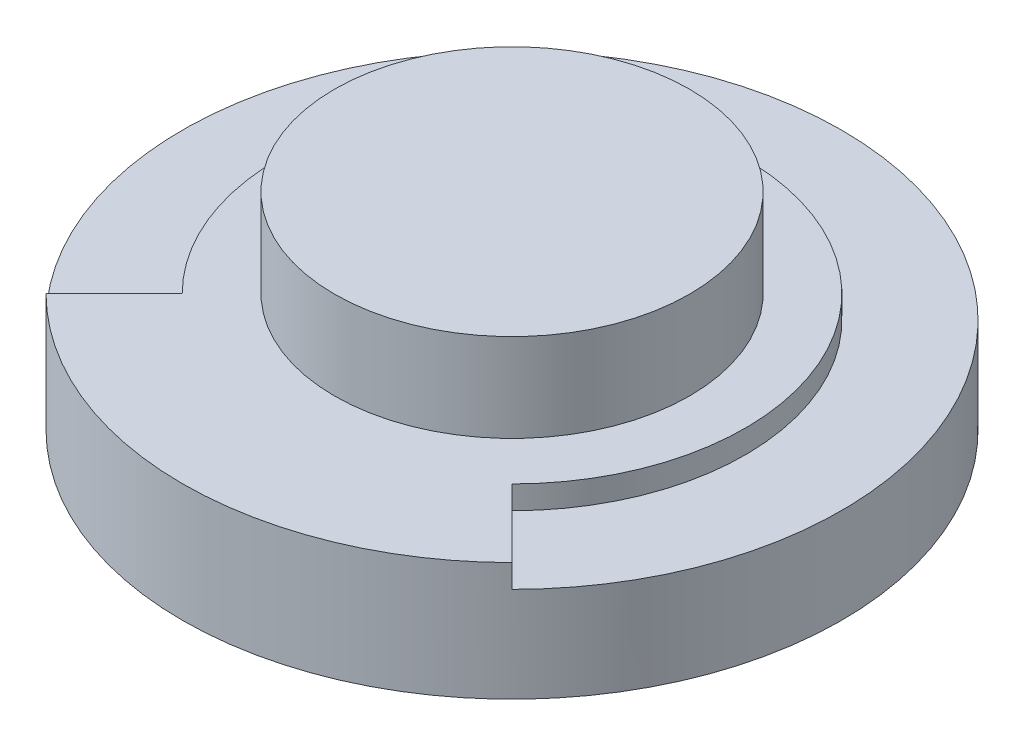
ISO-10303-21;
HEADER;
FILE_DESCRIPTION(('STEP AP214'),'2;1');
FILE_NAME('part.step','',(''),(''),'','','');
FILE_SCHEMA(('AUTOMOTIVE_DESIGN { 1 0 10303 214 1 1 1 1 }'));
ENDSEC;
DATA;
#1=APPLICATION_CONTEXT('core data for automotive mechanical design processes');
#2=APPLICATION_PROTOCOL_DEFINITION('international standard','automotive_design',2000,#1);
#3=PRODUCT_CONTEXT('',#1,'mechanical');
#4=PRODUCT('Part','Part','',(#3));
#5=PRODUCT_RELATED_PRODUCT_CATEGORY('part','',(#4));
#6=PRODUCT_DEFINITION_FORMATION('','',#4);
#7=PRODUCT_DEFINITION_CONTEXT('part definition',#1,'design');
#8=PRODUCT_DEFINITION('design','',#6,#7);
#9=PRODUCT_DEFINITION_SHAPE('','',#8);
#10=(LENGTH_UNIT() NAMED_UNIT(*) SI_UNIT(.MILLI.,.METRE.));
#11=(NAMED_UNIT(*) PLANE_ANGLE_UNIT() SI_UNIT($,.RADIAN.));
#12=(NAMED_UNIT(*) SI_UNIT($,.STERADIAN.) SOLID_ANGLE_UNIT());
#13=UNCERTAINTY_MEASURE_WITH_UNIT(LENGTH_MEASURE(1.E-05),#10,'distance_accuracy_value','');
#14=(GEOMETRIC_REPRESENTATION_CONTEXT(3) GLOBAL_UNCERTAINTY_ASSIGNED_CONTEXT((#13)) GLOBAL_UNIT_ASSIGNED_CONTEXT((#10,
#11,#12)) REPRESENTATION_CONTEXT('',''));
#15=CARTESIAN_POINT('',(0.,0.,0.));
#16=DIRECTION('',(0.,0.,1.));
#17=DIRECTION('',(1.,0.,0.));
#18=AXIS2_PLACEMENT_3D('',#15,#16,#17);
#19=CARTESIAN_POINT('',(0.,4.1,0.));
#20=DIRECTION('',(0.,-1.,0.));
#21=DIRECTION('',(0.,0.,-1.));
#22=AXIS2_PLACEMENT_3D('',#19,#20,#21);
#23=CYLINDRICAL_SURFACE('',#22,14.2);
#24=CARTESIAN_POINT('',(0.,4.1,0.));
#25=DIRECTION('',(0.,1.,0.));
#26=DIRECTION('',(0.,0.,1.));
#27=AXIS2_PLACEMENT_3D('',#24,#25,#26);
#28=CIRCLE('',#27,14.2);
#29=CARTESIAN_POINT('',(10.040916292849,4.1,10.040916292849));
#30=VERTEX_POINT('',#29);
#31=CARTESIAN_POINT('',(-10.040916292849,4.1,10.0409162928489));
#32=VERTEX_POINT('',#31);
#33=EDGE_CURVE('E12',#30,#32,#28,.T.);
#34=ORIENTED_EDGE('',*,*,#33,.F.);
#35=DIRECTION('',(0.,-1.,0.));
#36=VECTOR('',#35,1.);
#37=CARTESIAN_POINT('',(10.040916292849,5.1,10.040916292849));
#38=LINE('',#37,#36);
#39=CARTESIAN_POINT('',(10.040916292849,5.1,10.040916292849));
#40=VERTEX_POINT('',#39);
#41=EDGE_CURVE('E72',#40,#30,#38,.T.);
#42=ORIENTED_EDGE('',*,*,#41,.F.);
#43=CARTESIAN_POINT('',(0.,5.1,0.));
#44=DIRECTION('',(0.,1.,0.));
#45=DIRECTION('',(0.,0.,1.));
#46=AXIS2_PLACEMENT_3D('',#43,#44,#45);
#47=CIRCLE('',#46,14.2);
#48=CARTESIAN_POINT('',(-10.040916292849,5.1,10.0409162928489));
#49=VERTEX_POINT('',#48);
#50=EDGE_CURVE('E106',#49,#40,#47,.T.);
#51=ORIENTED_EDGE('',*,*,#50,.F.);
#52=DIRECTION('',(0.,-1.,0.));
#53=VECTOR('',#52,1.);
#54=CARTESIAN_POINT('',(-10.040916292849,5.1,10.0409162928489));
#55=LINE('',#54,#53);
#56=EDGE_CURVE('E112',#49,#32,#55,.T.);
#57=ORIENTED_EDGE('',*,*,#56,.T.);
#58=EDGE_LOOP('',(#34,#42,#51,#57));
#59=FACE_BOUND('',#58,.T.);
#60=CARTESIAN_POINT('',(0.,0.,0.));
#61=DIRECTION('',(0.,1.,0.));
#62=DIRECTION('',(0.,0.,1.));
#63=AXIS2_PLACEMENT_3D('',#60,#61,#62);
#64=CIRCLE('',#63,14.2);
#65=CARTESIAN_POINT('',(0.,0.,14.2));
#66=VERTEX_POINT('',#65);
#67=EDGE_CURVE('E64',#66,#66,#64,.T.);
#68=ORIENTED_EDGE('',*,*,#67,.T.);
#69=EDGE_LOOP('',(#68));
#70=FACE_BOUND('',#69,.T.);
#71=ADVANCED_FACE('F56',(#59,#70),#23,.T.);
#72=CARTESIAN_POINT('',(0.,4.1,0.));
#73=DIRECTION('',(0.,1.,0.));
#74=DIRECTION('',(0.,0.,1.));
#75=AXIS2_PLACEMENT_3D('',#72,#73,#74);
#76=PLANE('',#75);
#77=DIRECTION('',(-0.707106781186551,0.,0.707106781186544));
#78=VECTOR('',#77,1.);
#79=CARTESIAN_POINT('',(0.,4.1,0.));
#80=LINE('',#79,#78);
#81=CARTESIAN_POINT('',(-7.10642315092484,4.1,7.10642315092477));
#82=VERTEX_POINT('',#81);
#83=EDGE_CURVE('E115',#82,#32,#80,.T.);
#84=ORIENTED_EDGE('',*,*,#83,.F.);
#85=CARTESIAN_POINT('',(0.,4.1,0.));
#86=DIRECTION('',(0.,1.,0.));
#87=DIRECTION('',(0.,0.,1.));
#88=AXIS2_PLACEMENT_3D('',#85,#86,#87);
#89=CIRCLE('',#88,10.05);
#90=CARTESIAN_POINT('',(7.10642315092479,4.1,7.10642315092482));
#91=VERTEX_POINT('',#90);
#92=EDGE_CURVE('E131',#91,#82,#89,.T.);
#93=ORIENTED_EDGE('',*,*,#92,.F.);
#94=DIRECTION('',(0.707106781186546,0.,0.707106781186549));
#95=VECTOR('',#94,1.);
#96=CARTESIAN_POINT('',(0.,4.1,0.));
#97=LINE('',#96,#95);
#98=EDGE_CURVE('E109',#91,#30,#97,.T.);
#99=ORIENTED_EDGE('',*,*,#98,.T.);
#100=ORIENTED_EDGE('',*,*,#33,.T.);
#101=EDGE_LOOP('',(#84,#93,#99,#100));
#102=FACE_BOUND('',#101,.T.);
#103=ADVANCED_FACE('F137',(#102),#76,.T.);
#104=CARTESIAN_POINT('',(0.,0.,0.));
#105=DIRECTION('',(0.,1.,0.));
#106=DIRECTION('',(0.,0.,1.));
#107=AXIS2_PLACEMENT_3D('',#104,#105,#106);
#108=PLANE('',#107);
#109=ORIENTED_EDGE('',*,*,#67,.F.);
#110=EDGE_LOOP('',(#109));
#111=FACE_BOUND('',#110,.T.);
#112=ADVANCED_FACE('F135',(#111),#108,.F.);
#113=CARTESIAN_POINT('',(0.,5.1,0.));
#114=DIRECTION('',(0.707106781186544,0.,0.707106781186551));
#115=DIRECTION('',(0.707106781186551,0.,-0.707106781186544));
#116=AXIS2_PLACEMENT_3D('',#113,#114,#115);
#117=PLANE('',#116);
#118=ORIENTED_EDGE('',*,*,#83,.T.);
#119=ORIENTED_EDGE('',*,*,#56,.F.);
#120=DIRECTION('',(-0.707106781186551,0.,0.707106781186544));
#121=VECTOR('',#120,1.);
#122=CARTESIAN_POINT('',(0.,5.1,0.));
#123=LINE('',#122,#121);
#124=CARTESIAN_POINT('',(-7.10642315092484,5.1,7.10642315092477));
#125=VERTEX_POINT('',#124);
#126=EDGE_CURVE('E101',#125,#49,#123,.T.);
#127=ORIENTED_EDGE('',*,*,#126,.F.);
#128=DIRECTION('',(0.,-1.,0.));
#129=VECTOR('',#128,1.);
#130=CARTESIAN_POINT('',(-7.10642315092484,5.1,7.10642315092477));
#131=LINE('',#130,#129);
#132=EDGE_CURVE('E96',#125,#82,#131,.T.);
#133=ORIENTED_EDGE('',*,*,#132,.T.);
#134=EDGE_LOOP('',(#118,#119,#127,#133));
#135=FACE_BOUND('',#134,.T.);
#136=ADVANCED_FACE('F113',(#135),#117,.F.);
#137=CARTESIAN_POINT('',(0.,5.1,0.));
#138=DIRECTION('',(0.707106781186549,0.,-0.707106781186546));
#139=DIRECTION('',(-0.707106781186546,0.,-0.707106781186549));
#140=AXIS2_PLACEMENT_3D('',#137,#138,#139);
#141=PLANE('',#140);
#142=ORIENTED_EDGE('',*,*,#98,.F.);
#143=DIRECTION('',(0.,-1.,0.));
#144=VECTOR('',#143,1.);
#145=CARTESIAN_POINT('',(7.10642315092479,5.1,7.10642315092482));
#146=LINE('',#145,#144);
#147=CARTESIAN_POINT('',(7.10642315092479,5.1,7.10642315092482));
#148=VERTEX_POINT('',#147);
#149=EDGE_CURVE('E78',#148,#91,#146,.T.);
#150=ORIENTED_EDGE('',*,*,#149,.F.);
#151=DIRECTION('',(0.707106781186546,0.,0.707106781186549));
#152=VECTOR('',#151,1.);
#153=CARTESIAN_POINT('',(0.,5.1,0.));
#154=LINE('',#153,#152);
#155=EDGE_CURVE('E120',#148,#40,#154,.T.);
#156=ORIENTED_EDGE('',*,*,#155,.T.);
#157=ORIENTED_EDGE('',*,*,#41,.T.);
#158=EDGE_LOOP('',(#142,#150,#156,#157));
#159=FACE_BOUND('',#158,.T.);
#160=ADVANCED_FACE('F142',(#159),#141,.T.);
#161=CARTESIAN_POINT('',(0.,5.1,0.));
#162=DIRECTION('',(0.,1.,0.));
#163=DIRECTION('',(0.,0.,1.));
#164=AXIS2_PLACEMENT_3D('',#161,#162,#163);
#165=PLANE('',#164);
#166=CARTESIAN_POINT('',(0.,5.1,0.));
#167=DIRECTION('',(0.,1.,0.));
#168=DIRECTION('',(0.,0.,1.));
#169=AXIS2_PLACEMENT_3D('',#166,#167,#168);
#170=CIRCLE('',#169,7.65);
#171=CARTESIAN_POINT('',(0.,5.1,7.65));
#172=VERTEX_POINT('',#171);
#173=EDGE_CURVE('E59',#172,#172,#170,.F.);
#174=ORIENTED_EDGE('',*,*,#173,.T.);
#175=EDGE_LOOP('',(#174));
#176=FACE_BOUND('',#175,.T.);
#177=ORIENTED_EDGE('',*,*,#155,.F.);
#178=CARTESIAN_POINT('',(0.,5.1,0.));
#179=DIRECTION('',(0.,1.,0.));
#180=DIRECTION('',(0.,0.,1.));
#181=AXIS2_PLACEMENT_3D('',#178,#179,#180);
#182=CIRCLE('',#181,10.05);
#183=EDGE_CURVE('E107',#148,#125,#182,.T.);
#184=ORIENTED_EDGE('',*,*,#183,.T.);
#185=ORIENTED_EDGE('',*,*,#126,.T.);
#186=ORIENTED_EDGE('',*,*,#50,.T.);
#187=EDGE_LOOP('',(#177,#184,#185,#186));
#188=FACE_BOUND('',#187,.T.);
#189=ADVANCED_FACE('F104',(#176,#188),#165,.T.);
#190=CARTESIAN_POINT('',(0.,5.1,0.));
#191=DIRECTION('',(0.,-1.,0.));
#192=DIRECTION('',(0.,0.,-1.));
#193=AXIS2_PLACEMENT_3D('',#190,#191,#192);
#194=CYLINDRICAL_SURFACE('',#193,10.05);
#195=ORIENTED_EDGE('',*,*,#92,.T.);
#196=ORIENTED_EDGE('',*,*,#132,.F.);
#197=ORIENTED_EDGE('',*,*,#183,.F.);
#198=ORIENTED_EDGE('',*,*,#149,.T.);
#199=EDGE_LOOP('',(#195,#196,#197,#198));
#200=FACE_BOUND('',#199,.T.);
#201=ADVANCED_FACE('F179',(#200),#194,.T.);
#202=CARTESIAN_POINT('',(0.,8.9,0.));
#203=DIRECTION('',(0.,-1.,0.));
#204=DIRECTION('',(0.,0.,-1.));
#205=AXIS2_PLACEMENT_3D('',#202,#203,#204);
#206=CYLINDRICAL_SURFACE('',#205,7.65);
#207=ORIENTED_EDGE('',*,*,#173,.F.);
#208=EDGE_LOOP('',(#207));
#209=FACE_BOUND('',#208,.T.);
#210=CARTESIAN_POINT('',(0.,8.9,0.));
#211=DIRECTION('',(0.,1.,0.));
#212=DIRECTION('',(0.,0.,1.));
#213=AXIS2_PLACEMENT_3D('',#210,#211,#212);
#214=CIRCLE('',#213,7.65);
#215=CARTESIAN_POINT('',(0.,8.9,7.65));
#216=VERTEX_POINT('',#215);
#217=EDGE_CURVE('E241',#216,#216,#214,.T.);
#218=ORIENTED_EDGE('',*,*,#217,.F.);
#219=EDGE_LOOP('',(#218));
#220=FACE_BOUND('',#219,.T.);
#221=ADVANCED_FACE('F184',(#209,#220),#206,.T.);
#222=CARTESIAN_POINT('',(0.,8.9,0.));
#223=DIRECTION('',(0.,1.,0.));
#224=DIRECTION('',(0.,0.,1.));
#225=AXIS2_PLACEMENT_3D('',#222,#223,#224);
#226=PLANE('',#225);
#227=ORIENTED_EDGE('',*,*,#217,.T.);
#228=EDGE_LOOP('',(#227));
#229=FACE_BOUND('',#228,.T.);
#230=ADVANCED_FACE('F202',(#229),#226,.T.);
#231=CLOSED_SHELL('',(#71,#103,#112,#136,#160,#189,#201,#221,#230));
#232=MANIFOLD_SOLID_BREP('B2',#231);
#233=ADVANCED_BREP_SHAPE_REPRESENTATION('',(#18,#232),#14);
#234=SHAPE_DEFINITION_REPRESENTATION(#9,#233);
ENDSEC;
END-ISO-10303-21;
